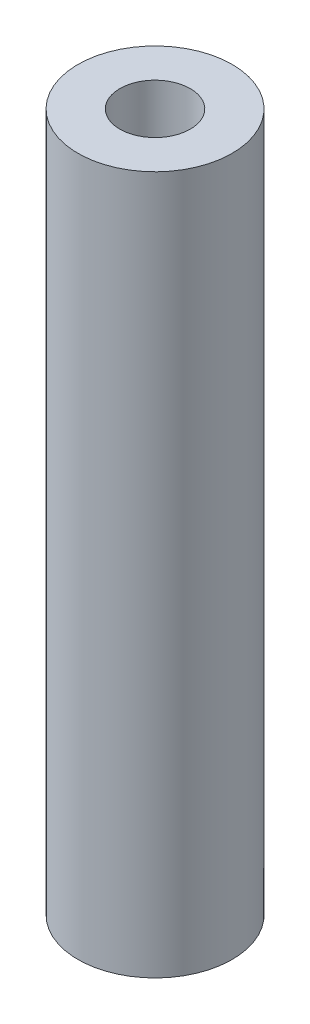
ISO-10303-21;
HEADER;
FILE_DESCRIPTION(('STEP AP214'),'2;1');
FILE_NAME('part.step','',(''),(''),'','','');
FILE_SCHEMA(('AUTOMOTIVE_DESIGN { 1 0 10303 214 1 1 1 1 }'));
ENDSEC;
DATA;
#1=APPLICATION_CONTEXT('core data for automotive mechanical design processes');
#2=APPLICATION_PROTOCOL_DEFINITION('international standard','automotive_design',2000,#1);
#3=PRODUCT_CONTEXT('',#1,'mechanical');
#4=PRODUCT('Part','Part','',(#3));
#5=PRODUCT_RELATED_PRODUCT_CATEGORY('part','',(#4));
#6=PRODUCT_DEFINITION_FORMATION('','',#4);
#7=PRODUCT_DEFINITION_CONTEXT('part definition',#1,'design');
#8=PRODUCT_DEFINITION('design','',#6,#7);
#9=PRODUCT_DEFINITION_SHAPE('','',#8);
#10=(LENGTH_UNIT() NAMED_UNIT(*) SI_UNIT(.MILLI.,.METRE.));
#11=(NAMED_UNIT(*) PLANE_ANGLE_UNIT() SI_UNIT($,.RADIAN.));
#12=(NAMED_UNIT(*) SI_UNIT($,.STERADIAN.) SOLID_ANGLE_UNIT());
#13=UNCERTAINTY_MEASURE_WITH_UNIT(LENGTH_MEASURE(1.E-05),#10,'distance_accuracy_value','');
#14=(GEOMETRIC_REPRESENTATION_CONTEXT(3) GLOBAL_UNCERTAINTY_ASSIGNED_CONTEXT((#13)) GLOBAL_UNIT_ASSIGNED_CONTEXT((#10,
#11,#12)) REPRESENTATION_CONTEXT('',''));
#15=CARTESIAN_POINT('',(0.,0.,0.));
#16=DIRECTION('',(0.,0.,1.));
#17=DIRECTION('',(1.,0.,0.));
#18=AXIS2_PLACEMENT_3D('',#15,#16,#17);
#19=CARTESIAN_POINT('',(0.,0.,0.));
#20=DIRECTION('',(0.,-1.,0.));
#21=DIRECTION('',(0.,0.,-1.));
#22=AXIS2_PLACEMENT_3D('',#19,#20,#21);
#23=CYLINDRICAL_SURFACE('',#22,3.20039999999999);
#24=CARTESIAN_POINT('',(0.,0.,0.));
#25=DIRECTION('',(0.,-1.,0.));
#26=DIRECTION('',(0.,0.,-1.));
#27=AXIS2_PLACEMENT_3D('',#24,#25,#26);
#28=CIRCLE('',#27,3.2004);
#29=CARTESIAN_POINT('',(0.,0.,-3.2004));
#30=VERTEX_POINT('',#29);
#31=EDGE_CURVE('E45',#30,#30,#28,.T.);
#32=ORIENTED_EDGE('',*,*,#31,.T.);
#33=EDGE_LOOP('',(#32));
#34=FACE_BOUND('',#33,.T.);
#35=CARTESIAN_POINT('',(0.,63.5,0.));
#36=DIRECTION('',(0.,-1.,0.));
#37=DIRECTION('',(0.,0.,-1.));
#38=AXIS2_PLACEMENT_3D('',#35,#36,#37);
#39=CIRCLE('',#38,3.20039999999998);
#40=CARTESIAN_POINT('',(0.,63.5,-3.20039999999998));
#41=VERTEX_POINT('',#40);
#42=EDGE_CURVE('E10',#41,#41,#39,.T.);
#43=ORIENTED_EDGE('',*,*,#42,.F.);
#44=EDGE_LOOP('',(#43));
#45=FACE_BOUND('',#44,.T.);
#46=ADVANCED_FACE('F31',(#34,#45),#23,.F.);
#47=CARTESIAN_POINT('',(3.20039999999998,63.5,0.));
#48=DIRECTION('',(0.,1.,0.));
#49=DIRECTION('',(0.,0.,1.));
#50=AXIS2_PLACEMENT_3D('',#47,#48,#49);
#51=PLANE('',#50);
#52=ORIENTED_EDGE('',*,*,#42,.T.);
#53=EDGE_LOOP('',(#52));
#54=FACE_BOUND('',#53,.T.);
#55=CARTESIAN_POINT('',(0.,63.5,0.));
#56=DIRECTION('',(0.,-1.,0.));
#57=DIRECTION('',(0.,0.,-1.));
#58=AXIS2_PLACEMENT_3D('',#55,#56,#57);
#59=CIRCLE('',#58,7.0104);
#60=CARTESIAN_POINT('',(0.,63.5,-7.0104));
#61=VERTEX_POINT('',#60);
#62=EDGE_CURVE('E37',#61,#61,#59,.T.);
#63=ORIENTED_EDGE('',*,*,#62,.F.);
#64=EDGE_LOOP('',(#63));
#65=FACE_BOUND('',#64,.T.);
#66=ADVANCED_FACE('F61',(#54,#65),#51,.T.);
#67=CARTESIAN_POINT('',(0.,0.,0.));
#68=DIRECTION('',(0.,-1.,0.));
#69=DIRECTION('',(0.,0.,-1.));
#70=AXIS2_PLACEMENT_3D('',#67,#68,#69);
#71=CYLINDRICAL_SURFACE('',#70,7.0104);
#72=ORIENTED_EDGE('',*,*,#62,.T.);
#73=EDGE_LOOP('',(#72));
#74=FACE_BOUND('',#73,.T.);
#75=CARTESIAN_POINT('',(0.,0.,0.));
#76=DIRECTION('',(0.,-1.,0.));
#77=DIRECTION('',(0.,0.,-1.));
#78=AXIS2_PLACEMENT_3D('',#75,#76,#77);
#79=CIRCLE('',#78,7.0104);
#80=CARTESIAN_POINT('',(0.,0.,-7.0104));
#81=VERTEX_POINT('',#80);
#82=EDGE_CURVE('E41',#81,#81,#79,.T.);
#83=ORIENTED_EDGE('',*,*,#82,.F.);
#84=EDGE_LOOP('',(#83));
#85=FACE_BOUND('',#84,.T.);
#86=ADVANCED_FACE('F55',(#74,#85),#71,.T.);
#87=CARTESIAN_POINT('',(3.2004,0.,0.));
#88=DIRECTION('',(0.,-1.,0.));
#89=DIRECTION('',(0.,0.,-1.));
#90=AXIS2_PLACEMENT_3D('',#87,#88,#89);
#91=PLANE('',#90);
#92=ORIENTED_EDGE('',*,*,#82,.T.);
#93=EDGE_LOOP('',(#92));
#94=FACE_BOUND('',#93,.T.);
#95=ORIENTED_EDGE('',*,*,#31,.F.);
#96=EDGE_LOOP('',(#95));
#97=FACE_BOUND('',#96,.T.);
#98=ADVANCED_FACE('F53',(#94,#97),#91,.T.);
#99=CLOSED_SHELL('',(#46,#66,#86,#98));
#100=MANIFOLD_SOLID_BREP('B2',#99);
#101=ADVANCED_BREP_SHAPE_REPRESENTATION('',(#18,#100),#14);
#102=SHAPE_DEFINITION_REPRESENTATION(#9,#101);
ENDSEC;
END-ISO-10303-21;
